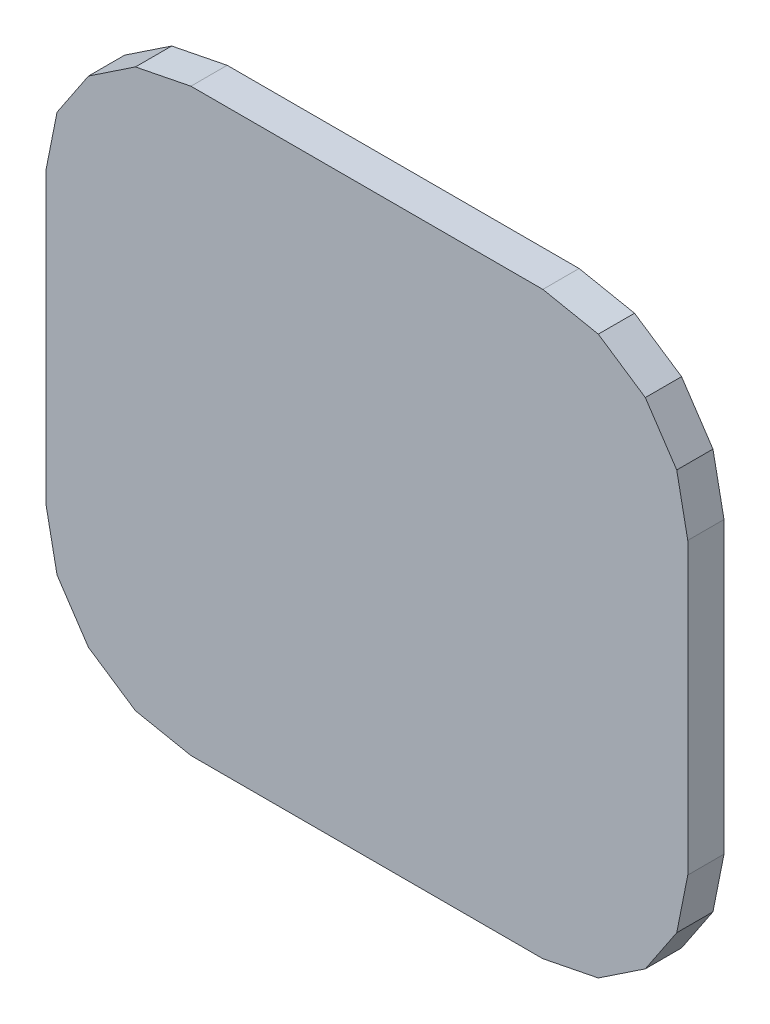
ISO-10303-21;
HEADER;
FILE_DESCRIPTION(('STEP AP214'),'2;1');
FILE_NAME('part.step','',(''),(''),'','','');
FILE_SCHEMA(('AUTOMOTIVE_DESIGN { 1 0 10303 214 1 1 1 1 }'));
ENDSEC;
DATA;
#1=APPLICATION_CONTEXT('core data for automotive mechanical design processes');
#2=APPLICATION_PROTOCOL_DEFINITION('international standard','automotive_design',2000,#1);
#3=PRODUCT_CONTEXT('',#1,'mechanical');
#4=PRODUCT('Part','Part','',(#3));
#5=PRODUCT_RELATED_PRODUCT_CATEGORY('part','',(#4));
#6=PRODUCT_DEFINITION_FORMATION('','',#4);
#7=PRODUCT_DEFINITION_CONTEXT('part definition',#1,'design');
#8=PRODUCT_DEFINITION('design','',#6,#7);
#9=PRODUCT_DEFINITION_SHAPE('','',#8);
#10=(LENGTH_UNIT() NAMED_UNIT(*) SI_UNIT(.MILLI.,.METRE.));
#11=(NAMED_UNIT(*) PLANE_ANGLE_UNIT() SI_UNIT($,.RADIAN.));
#12=(NAMED_UNIT(*) SI_UNIT($,.STERADIAN.) SOLID_ANGLE_UNIT());
#13=UNCERTAINTY_MEASURE_WITH_UNIT(LENGTH_MEASURE(1.E-05),#10,'distance_accuracy_value','');
#14=(GEOMETRIC_REPRESENTATION_CONTEXT(3) GLOBAL_UNCERTAINTY_ASSIGNED_CONTEXT((#13)) GLOBAL_UNIT_ASSIGNED_CONTEXT((#10,
#11,#12)) REPRESENTATION_CONTEXT('',''));
#15=CARTESIAN_POINT('',(0.,0.,0.));
#16=DIRECTION('',(0.,0.,1.));
#17=DIRECTION('',(1.,0.,0.));
#18=AXIS2_PLACEMENT_3D('',#15,#16,#17);
#19=CARTESIAN_POINT('',(78.76,-110.75,1.635));
#20=DIRECTION('',(0.,0.,-1.));
#21=DIRECTION('',(0.,-1.,0.));
#22=AXIS2_PLACEMENT_3D('',#19,#20,#21);
#23=PLANE('',#22);
#24=DIRECTION('',(0.980785031686367,-0.195091572396073,0.));
#25=VECTOR('',#24,1.);
#26=CARTESIAN_POINT('',(78.93,-110.47,1.635));
#27=LINE('',#26,#25);
#28=CARTESIAN_POINT('',(78.93,-110.47,1.635));
#29=VERTEX_POINT('',#28);
#30=CARTESIAN_POINT('',(78.983576,-110.480657,1.635));
#31=VERTEX_POINT('',#30);
#32=EDGE_CURVE('E26',#29,#31,#27,.T.);
#33=ORIENTED_EDGE('',*,*,#32,.F.);
#34=DIRECTION('',(1.,0.,0.));
#35=VECTOR('',#34,1.);
#36=CARTESIAN_POINT('',(78.59,-110.47,1.635));
#37=LINE('',#36,#35);
#38=CARTESIAN_POINT('',(78.59,-110.47,1.635));
#39=VERTEX_POINT('',#38);
#40=EDGE_CURVE('E20',#39,#29,#37,.T.);
#41=ORIENTED_EDGE('',*,*,#40,.F.);
#42=DIRECTION('',(0.980785031686367,0.195091572396073,0.));
#43=VECTOR('',#42,1.);
#44=CARTESIAN_POINT('',(78.536424,-110.480657,1.635));
#45=LINE('',#44,#43);
#46=CARTESIAN_POINT('',(78.536424,-110.480657,1.635));
#47=VERTEX_POINT('',#46);
#48=EDGE_CURVE('E258',#47,#39,#45,.T.);
#49=ORIENTED_EDGE('',*,*,#48,.F.);
#50=DIRECTION('',(0.831469659284406,0.555570162706272,0.));
#51=VECTOR('',#50,1.);
#52=CARTESIAN_POINT('',(78.491005,-110.511005,1.635));
#53=LINE('',#52,#51);
#54=CARTESIAN_POINT('',(78.491005,-110.511005,1.635));
#55=VERTEX_POINT('',#54);
#56=EDGE_CURVE('E351',#55,#47,#53,.T.);
#57=ORIENTED_EDGE('',*,*,#56,.F.);
#58=DIRECTION('',(0.555570162706272,0.831469659284406,0.));
#59=VECTOR('',#58,1.);
#60=CARTESIAN_POINT('',(78.460657,-110.556424,1.635));
#61=LINE('',#60,#59);
#62=CARTESIAN_POINT('',(78.460657,-110.556424,1.635));
#63=VERTEX_POINT('',#62);
#64=EDGE_CURVE('E339',#63,#55,#61,.T.);
#65=ORIENTED_EDGE('',*,*,#64,.F.);
#66=DIRECTION('',(0.195091572396073,0.980785031686367,0.));
#67=VECTOR('',#66,1.);
#68=CARTESIAN_POINT('',(78.45,-110.61,1.635));
#69=LINE('',#68,#67);
#70=CARTESIAN_POINT('',(78.45,-110.61,1.635));
#71=VERTEX_POINT('',#70);
#72=EDGE_CURVE('E269',#71,#63,#69,.T.);
#73=ORIENTED_EDGE('',*,*,#72,.F.);
#74=DIRECTION('',(0.,1.,0.));
#75=VECTOR('',#74,1.);
#76=CARTESIAN_POINT('',(78.45,-110.89,1.635));
#77=LINE('',#76,#75);
#78=CARTESIAN_POINT('',(78.45,-110.89,1.635));
#79=VERTEX_POINT('',#78);
#80=EDGE_CURVE('E402',#79,#71,#77,.T.);
#81=ORIENTED_EDGE('',*,*,#80,.F.);
#82=DIRECTION('',(-0.195091572396073,0.980785031686367,0.));
#83=VECTOR('',#82,1.);
#84=CARTESIAN_POINT('',(78.460657,-110.943576,1.635));
#85=LINE('',#84,#83);
#86=CARTESIAN_POINT('',(78.460657,-110.943576,1.635));
#87=VERTEX_POINT('',#86);
#88=EDGE_CURVE('E322',#87,#79,#85,.T.);
#89=ORIENTED_EDGE('',*,*,#88,.F.);
#90=DIRECTION('',(-0.555570162706272,0.831469659284406,0.));
#91=VECTOR('',#90,1.);
#92=CARTESIAN_POINT('',(78.491005,-110.988995,1.635));
#93=LINE('',#92,#91);
#94=CARTESIAN_POINT('',(78.491005,-110.988995,1.635));
#95=VERTEX_POINT('',#94);
#96=EDGE_CURVE('E310',#95,#87,#93,.T.);
#97=ORIENTED_EDGE('',*,*,#96,.F.);
#98=DIRECTION('',(-0.831469659284406,0.555570162706272,0.));
#99=VECTOR('',#98,1.);
#100=CARTESIAN_POINT('',(78.536424,-111.019343,1.635));
#101=LINE('',#100,#99);
#102=CARTESIAN_POINT('',(78.536424,-111.019343,1.635));
#103=VERTEX_POINT('',#102);
#104=EDGE_CURVE('E296',#103,#95,#101,.T.);
#105=ORIENTED_EDGE('',*,*,#104,.F.);
#106=DIRECTION('',(-0.980785031686367,0.195091572396073,0.));
#107=VECTOR('',#106,1.);
#108=CARTESIAN_POINT('',(78.59,-111.03,1.635));
#109=LINE('',#108,#107);
#110=CARTESIAN_POINT('',(78.59,-111.03,1.635));
#111=VERTEX_POINT('',#110);
#112=EDGE_CURVE('E244',#111,#103,#109,.T.);
#113=ORIENTED_EDGE('',*,*,#112,.F.);
#114=DIRECTION('',(-1.,0.,0.));
#115=VECTOR('',#114,1.);
#116=CARTESIAN_POINT('',(78.93,-111.03,1.635));
#117=LINE('',#116,#115);
#118=CARTESIAN_POINT('',(78.93,-111.03,1.635));
#119=VERTEX_POINT('',#118);
#120=EDGE_CURVE('E278',#119,#111,#117,.T.);
#121=ORIENTED_EDGE('',*,*,#120,.F.);
#122=DIRECTION('',(-0.980785031686367,-0.195091572396073,0.));
#123=VECTOR('',#122,1.);
#124=CARTESIAN_POINT('',(78.983576,-111.019343,1.635));
#125=LINE('',#124,#123);
#126=CARTESIAN_POINT('',(78.983576,-111.019343,1.635));
#127=VERTEX_POINT('',#126);
#128=EDGE_CURVE('E263',#127,#119,#125,.T.);
#129=ORIENTED_EDGE('',*,*,#128,.F.);
#130=DIRECTION('',(-0.831469659284406,-0.555570162706272,0.));
#131=VECTOR('',#130,1.);
#132=CARTESIAN_POINT('',(79.028995,-110.988995,1.635));
#133=LINE('',#132,#131);
#134=CARTESIAN_POINT('',(79.028995,-110.988995,1.635));
#135=VERTEX_POINT('',#134);
#136=EDGE_CURVE('E203',#135,#127,#133,.T.);
#137=ORIENTED_EDGE('',*,*,#136,.F.);
#138=DIRECTION('',(-0.555570162706272,-0.831469659284406,0.));
#139=VECTOR('',#138,1.);
#140=CARTESIAN_POINT('',(79.059343,-110.943576,1.635));
#141=LINE('',#140,#139);
#142=CARTESIAN_POINT('',(79.059343,-110.943576,1.635));
#143=VERTEX_POINT('',#142);
#144=EDGE_CURVE('E197',#143,#135,#141,.T.);
#145=ORIENTED_EDGE('',*,*,#144,.F.);
#146=DIRECTION('',(-0.195091572396073,-0.980785031686367,0.));
#147=VECTOR('',#146,1.);
#148=CARTESIAN_POINT('',(79.07,-110.89,1.635));
#149=LINE('',#148,#147);
#150=CARTESIAN_POINT('',(79.07,-110.89,1.635));
#151=VERTEX_POINT('',#150);
#152=EDGE_CURVE('E200',#151,#143,#149,.T.);
#153=ORIENTED_EDGE('',*,*,#152,.F.);
#154=DIRECTION('',(0.,-1.,0.));
#155=VECTOR('',#154,1.);
#156=CARTESIAN_POINT('',(79.07,-110.61,1.635));
#157=LINE('',#156,#155);
#158=CARTESIAN_POINT('',(79.07,-110.61,1.635));
#159=VERTEX_POINT('',#158);
#160=EDGE_CURVE('E408',#159,#151,#157,.T.);
#161=ORIENTED_EDGE('',*,*,#160,.F.);
#162=DIRECTION('',(0.195091572396073,-0.980785031686367,0.));
#163=VECTOR('',#162,1.);
#164=CARTESIAN_POINT('',(79.059343,-110.556424,1.635));
#165=LINE('',#164,#163);
#166=CARTESIAN_POINT('',(79.059343,-110.556424,1.635));
#167=VERTEX_POINT('',#166);
#168=EDGE_CURVE('E435',#167,#159,#165,.T.);
#169=ORIENTED_EDGE('',*,*,#168,.F.);
#170=DIRECTION('',(0.555570162706272,-0.831469659284406,0.));
#171=VECTOR('',#170,1.);
#172=CARTESIAN_POINT('',(79.028995,-110.511005,1.635));
#173=LINE('',#172,#171);
#174=CARTESIAN_POINT('',(79.028995,-110.511005,1.635));
#175=VERTEX_POINT('',#174);
#176=EDGE_CURVE('E391',#175,#167,#173,.T.);
#177=ORIENTED_EDGE('',*,*,#176,.F.);
#178=DIRECTION('',(0.831469659284406,-0.555570162706272,0.));
#179=VECTOR('',#178,1.);
#180=CARTESIAN_POINT('',(78.983576,-110.480657,1.635));
#181=LINE('',#180,#179);
#182=EDGE_CURVE('E394',#31,#175,#181,.T.);
#183=ORIENTED_EDGE('',*,*,#182,.F.);
#184=EDGE_LOOP('',(#33,#41,#49,#57,#65,#73,#81,#89,#97,#105,#113,#121,#129,#137,#145,#153,#161,
#169,#177,#183));
#185=FACE_BOUND('',#184,.T.);
#186=ADVANCED_FACE('F17',(#185),#23,.F.);
#187=CARTESIAN_POINT('',(78.76,-110.75,1.6));
#188=DIRECTION('',(0.,0.,-1.));
#189=DIRECTION('',(0.,-1.,0.));
#190=AXIS2_PLACEMENT_3D('',#187,#188,#189);
#191=PLANE('',#190);
#192=DIRECTION('',(0.831469659284406,-0.555570162706272,0.));
#193=VECTOR('',#192,1.);
#194=CARTESIAN_POINT('',(78.983576,-110.480657,1.6));
#195=LINE('',#194,#193);
#196=CARTESIAN_POINT('',(78.983576,-110.480657,1.6));
#197=VERTEX_POINT('',#196);
#198=CARTESIAN_POINT('',(79.028995,-110.511005,1.6));
#199=VERTEX_POINT('',#198);
#200=EDGE_CURVE('E381',#197,#199,#195,.T.);
#201=ORIENTED_EDGE('',*,*,#200,.T.);
#202=DIRECTION('',(0.555570162706272,-0.831469659284406,0.));
#203=VECTOR('',#202,1.);
#204=CARTESIAN_POINT('',(79.028995,-110.511005,1.6));
#205=LINE('',#204,#203);
#206=CARTESIAN_POINT('',(79.059343,-110.556424,1.6));
#207=VERTEX_POINT('',#206);
#208=EDGE_CURVE('E428',#199,#207,#205,.T.);
#209=ORIENTED_EDGE('',*,*,#208,.T.);
#210=DIRECTION('',(0.195091572396073,-0.980785031686367,0.));
#211=VECTOR('',#210,1.);
#212=CARTESIAN_POINT('',(79.059343,-110.556424,1.6));
#213=LINE('',#212,#211);
#214=CARTESIAN_POINT('',(79.07,-110.61,1.6));
#215=VERTEX_POINT('',#214);
#216=EDGE_CURVE('E405',#207,#215,#213,.T.);
#217=ORIENTED_EDGE('',*,*,#216,.T.);
#218=DIRECTION('',(0.,-1.,0.));
#219=VECTOR('',#218,1.);
#220=CARTESIAN_POINT('',(79.07,-110.61,1.6));
#221=LINE('',#220,#219);
#222=CARTESIAN_POINT('',(79.07,-110.89,1.6));
#223=VERTEX_POINT('',#222);
#224=EDGE_CURVE('E225',#215,#223,#221,.T.);
#225=ORIENTED_EDGE('',*,*,#224,.T.);
#226=DIRECTION('',(-0.195091572396073,-0.980785031686367,0.));
#227=VECTOR('',#226,1.);
#228=CARTESIAN_POINT('',(79.07,-110.89,1.6));
#229=LINE('',#228,#227);
#230=CARTESIAN_POINT('',(79.059343,-110.943576,1.6));
#231=VERTEX_POINT('',#230);
#232=EDGE_CURVE('E209',#223,#231,#229,.T.);
#233=ORIENTED_EDGE('',*,*,#232,.T.);
#234=DIRECTION('',(-0.555570162706272,-0.831469659284406,0.));
#235=VECTOR('',#234,1.);
#236=CARTESIAN_POINT('',(79.059343,-110.943576,1.6));
#237=LINE('',#236,#235);
#238=CARTESIAN_POINT('',(79.028995,-110.988995,1.6));
#239=VERTEX_POINT('',#238);
#240=EDGE_CURVE('E215',#231,#239,#237,.T.);
#241=ORIENTED_EDGE('',*,*,#240,.T.);
#242=DIRECTION('',(-0.831469659284406,-0.555570162706272,0.));
#243=VECTOR('',#242,1.);
#244=CARTESIAN_POINT('',(79.028995,-110.988995,1.6));
#245=LINE('',#244,#243);
#246=CARTESIAN_POINT('',(78.983576,-111.019343,1.6));
#247=VERTEX_POINT('',#246);
#248=EDGE_CURVE('E253',#239,#247,#245,.T.);
#249=ORIENTED_EDGE('',*,*,#248,.T.);
#250=DIRECTION('',(-0.980785031686367,-0.195091572396073,0.));
#251=VECTOR('',#250,1.);
#252=CARTESIAN_POINT('',(78.983576,-111.019343,1.6));
#253=LINE('',#252,#251);
#254=CARTESIAN_POINT('',(78.93,-111.03,1.6));
#255=VERTEX_POINT('',#254);
#256=EDGE_CURVE('E274',#247,#255,#253,.T.);
#257=ORIENTED_EDGE('',*,*,#256,.T.);
#258=DIRECTION('',(-1.,0.,0.));
#259=VECTOR('',#258,1.);
#260=CARTESIAN_POINT('',(78.93,-111.03,1.6));
#261=LINE('',#260,#259);
#262=CARTESIAN_POINT('',(78.59,-111.03,1.6));
#263=VERTEX_POINT('',#262);
#264=EDGE_CURVE('E286',#255,#263,#261,.T.);
#265=ORIENTED_EDGE('',*,*,#264,.T.);
#266=DIRECTION('',(-0.980785031686367,0.195091572396073,0.));
#267=VECTOR('',#266,1.);
#268=CARTESIAN_POINT('',(78.59,-111.03,1.6));
#269=LINE('',#268,#267);
#270=CARTESIAN_POINT('',(78.536424,-111.019343,1.6));
#271=VERTEX_POINT('',#270);
#272=EDGE_CURVE('E243',#263,#271,#269,.T.);
#273=ORIENTED_EDGE('',*,*,#272,.T.);
#274=DIRECTION('',(-0.831469659284406,0.555570162706272,0.));
#275=VECTOR('',#274,1.);
#276=CARTESIAN_POINT('',(78.536424,-111.019343,1.6));
#277=LINE('',#276,#275);
#278=CARTESIAN_POINT('',(78.491005,-110.988995,1.6));
#279=VERTEX_POINT('',#278);
#280=EDGE_CURVE('E304',#271,#279,#277,.T.);
#281=ORIENTED_EDGE('',*,*,#280,.T.);
#282=DIRECTION('',(-0.555570162706272,0.831469659284406,0.));
#283=VECTOR('',#282,1.);
#284=CARTESIAN_POINT('',(78.491005,-110.988995,1.6));
#285=LINE('',#284,#283);
#286=CARTESIAN_POINT('',(78.460657,-110.943576,1.6));
#287=VERTEX_POINT('',#286);
#288=EDGE_CURVE('E318',#279,#287,#285,.T.);
#289=ORIENTED_EDGE('',*,*,#288,.T.);
#290=DIRECTION('',(-0.195091572396073,0.980785031686367,0.));
#291=VECTOR('',#290,1.);
#292=CARTESIAN_POINT('',(78.460657,-110.943576,1.6));
#293=LINE('',#292,#291);
#294=CARTESIAN_POINT('',(78.45,-110.89,1.6));
#295=VERTEX_POINT('',#294);
#296=EDGE_CURVE('E326',#287,#295,#293,.T.);
#297=ORIENTED_EDGE('',*,*,#296,.T.);
#298=DIRECTION('',(0.,1.,0.));
#299=VECTOR('',#298,1.);
#300=CARTESIAN_POINT('',(78.45,-110.89,1.6));
#301=LINE('',#300,#299);
#302=CARTESIAN_POINT('',(78.45,-110.61,1.6));
#303=VERTEX_POINT('',#302);
#304=EDGE_CURVE('E328',#295,#303,#301,.T.);
#305=ORIENTED_EDGE('',*,*,#304,.T.);
#306=DIRECTION('',(0.195091572396073,0.980785031686367,0.));
#307=VECTOR('',#306,1.);
#308=CARTESIAN_POINT('',(78.45,-110.61,1.6));
#309=LINE('',#308,#307);
#310=CARTESIAN_POINT('',(78.460657,-110.556424,1.6));
#311=VERTEX_POINT('',#310);
#312=EDGE_CURVE('E268',#303,#311,#309,.T.);
#313=ORIENTED_EDGE('',*,*,#312,.T.);
#314=DIRECTION('',(0.555570162706272,0.831469659284406,0.));
#315=VECTOR('',#314,1.);
#316=CARTESIAN_POINT('',(78.460657,-110.556424,1.6));
#317=LINE('',#316,#315);
#318=CARTESIAN_POINT('',(78.491005,-110.511005,1.6));
#319=VERTEX_POINT('',#318);
#320=EDGE_CURVE('E347',#311,#319,#317,.T.);
#321=ORIENTED_EDGE('',*,*,#320,.T.);
#322=DIRECTION('',(0.831469659284406,0.555570162706272,0.));
#323=VECTOR('',#322,1.);
#324=CARTESIAN_POINT('',(78.491005,-110.511005,1.6));
#325=LINE('',#324,#323);
#326=CARTESIAN_POINT('',(78.536424,-110.480657,1.6));
#327=VERTEX_POINT('',#326);
#328=EDGE_CURVE('E254',#319,#327,#325,.T.);
#329=ORIENTED_EDGE('',*,*,#328,.T.);
#330=DIRECTION('',(0.980785031686367,0.195091572396073,0.));
#331=VECTOR('',#330,1.);
#332=CARTESIAN_POINT('',(78.536424,-110.480657,1.6));
#333=LINE('',#332,#331);
#334=CARTESIAN_POINT('',(78.59,-110.47,1.6));
#335=VERTEX_POINT('',#334);
#336=EDGE_CURVE('E358',#327,#335,#333,.T.);
#337=ORIENTED_EDGE('',*,*,#336,.T.);
#338=DIRECTION('',(1.,0.,0.));
#339=VECTOR('',#338,1.);
#340=CARTESIAN_POINT('',(78.59,-110.47,1.6));
#341=LINE('',#340,#339);
#342=CARTESIAN_POINT('',(78.93,-110.47,1.6));
#343=VERTEX_POINT('',#342);
#344=EDGE_CURVE('E279',#335,#343,#341,.T.);
#345=ORIENTED_EDGE('',*,*,#344,.T.);
#346=DIRECTION('',(0.980785031686367,-0.195091572396073,0.));
#347=VECTOR('',#346,1.);
#348=CARTESIAN_POINT('',(78.93,-110.47,1.6));
#349=LINE('',#348,#347);
#350=EDGE_CURVE('E11',#343,#197,#349,.T.);
#351=ORIENTED_EDGE('',*,*,#350,.T.);
#352=EDGE_LOOP('',(#201,#209,#217,#225,#233,#241,#249,#257,#265,#273,#281,#289,#297,#305,#313,
#321,#329,#337,#345,#351));
#353=FACE_BOUND('',#352,.T.);
#354=ADVANCED_FACE('F378',(#353),#191,.T.);
#355=CARTESIAN_POINT('',(78.93,-110.47,1.6));
#356=DIRECTION('',(0.195091572396073,0.980785031686367,0.));
#357=DIRECTION('',(0.,0.,-1.));
#358=AXIS2_PLACEMENT_3D('',#355,#356,#357);
#359=PLANE('',#358);
#360=DIRECTION('',(0.,0.,1.));
#361=VECTOR('',#360,1.);
#362=CARTESIAN_POINT('',(78.93,-110.47,1.6));
#363=LINE('',#362,#361);
#364=EDGE_CURVE('E235',#343,#29,#363,.T.);
#365=ORIENTED_EDGE('',*,*,#364,.T.);
#366=ORIENTED_EDGE('',*,*,#32,.T.);
#367=DIRECTION('',(0.,0.,1.));
#368=VECTOR('',#367,1.);
#369=CARTESIAN_POINT('',(78.983576,-110.480657,1.6));
#370=LINE('',#369,#368);
#371=EDGE_CURVE('E387',#197,#31,#370,.T.);
#372=ORIENTED_EDGE('',*,*,#371,.F.);
#373=ORIENTED_EDGE('',*,*,#350,.F.);
#374=EDGE_LOOP('',(#365,#366,#372,#373));
#375=FACE_BOUND('',#374,.T.);
#376=ADVANCED_FACE('F374',(#375),#359,.T.);
#377=CARTESIAN_POINT('',(78.59,-110.47,1.6));
#378=DIRECTION('',(0.,1.,0.));
#379=DIRECTION('',(1.,0.,0.));
#380=AXIS2_PLACEMENT_3D('',#377,#378,#379);
#381=PLANE('',#380);
#382=DIRECTION('',(0.,0.,1.));
#383=VECTOR('',#382,1.);
#384=CARTESIAN_POINT('',(78.59,-110.47,1.6));
#385=LINE('',#384,#383);
#386=EDGE_CURVE('E355',#335,#39,#385,.T.);
#387=ORIENTED_EDGE('',*,*,#386,.T.);
#388=ORIENTED_EDGE('',*,*,#40,.T.);
#389=ORIENTED_EDGE('',*,*,#364,.F.);
#390=ORIENTED_EDGE('',*,*,#344,.F.);
#391=EDGE_LOOP('',(#387,#388,#389,#390));
#392=FACE_BOUND('',#391,.T.);
#393=ADVANCED_FACE('F375',(#392),#381,.T.);
#394=CARTESIAN_POINT('',(78.536424,-110.480657,1.6));
#395=DIRECTION('',(-0.195091572396073,0.980785031686367,0.));
#396=DIRECTION('',(0.,0.,1.));
#397=AXIS2_PLACEMENT_3D('',#394,#395,#396);
#398=PLANE('',#397);
#399=DIRECTION('',(0.,0.,1.));
#400=VECTOR('',#399,1.);
#401=CARTESIAN_POINT('',(78.536424,-110.480657,1.6));
#402=LINE('',#401,#400);
#403=EDGE_CURVE('E259',#327,#47,#402,.T.);
#404=ORIENTED_EDGE('',*,*,#403,.T.);
#405=ORIENTED_EDGE('',*,*,#48,.T.);
#406=ORIENTED_EDGE('',*,*,#386,.F.);
#407=ORIENTED_EDGE('',*,*,#336,.F.);
#408=EDGE_LOOP('',(#404,#405,#406,#407));
#409=FACE_BOUND('',#408,.T.);
#410=ADVANCED_FACE('F783',(#409),#398,.T.);
#411=CARTESIAN_POINT('',(78.491005,-110.511005,1.6));
#412=DIRECTION('',(-0.555570162706272,0.831469659284406,0.));
#413=DIRECTION('',(0.,0.,1.));
#414=AXIS2_PLACEMENT_3D('',#411,#412,#413);
#415=PLANE('',#414);
#416=DIRECTION('',(0.,0.,1.));
#417=VECTOR('',#416,1.);
#418=CARTESIAN_POINT('',(78.491005,-110.511005,1.6));
#419=LINE('',#418,#417);
#420=EDGE_CURVE('E343',#319,#55,#419,.T.);
#421=ORIENTED_EDGE('',*,*,#420,.T.);
#422=ORIENTED_EDGE('',*,*,#56,.T.);
#423=ORIENTED_EDGE('',*,*,#403,.F.);
#424=ORIENTED_EDGE('',*,*,#328,.F.);
#425=EDGE_LOOP('',(#421,#422,#423,#424));
#426=FACE_BOUND('',#425,.T.);
#427=ADVANCED_FACE('F774',(#426),#415,.T.);
#428=CARTESIAN_POINT('',(78.460657,-110.556424,1.6));
#429=DIRECTION('',(-0.831469659284406,0.555570162706272,0.));
#430=DIRECTION('',(0.,0.,1.));
#431=AXIS2_PLACEMENT_3D('',#428,#429,#430);
#432=PLANE('',#431);
#433=DIRECTION('',(0.,0.,1.));
#434=VECTOR('',#433,1.);
#435=CARTESIAN_POINT('',(78.460657,-110.556424,1.6));
#436=LINE('',#435,#434);
#437=EDGE_CURVE('E264',#311,#63,#436,.T.);
#438=ORIENTED_EDGE('',*,*,#437,.T.);
#439=ORIENTED_EDGE('',*,*,#64,.T.);
#440=ORIENTED_EDGE('',*,*,#420,.F.);
#441=ORIENTED_EDGE('',*,*,#320,.F.);
#442=EDGE_LOOP('',(#438,#439,#440,#441));
#443=FACE_BOUND('',#442,.T.);
#444=ADVANCED_FACE('F765',(#443),#432,.T.);
#445=CARTESIAN_POINT('',(78.45,-110.61,1.6));
#446=DIRECTION('',(-0.980785031686367,0.195091572396073,0.));
#447=DIRECTION('',(0.,0.,1.));
#448=AXIS2_PLACEMENT_3D('',#445,#446,#447);
#449=PLANE('',#448);
#450=DIRECTION('',(0.,0.,1.));
#451=VECTOR('',#450,1.);
#452=CARTESIAN_POINT('',(78.45,-110.61,1.6));
#453=LINE('',#452,#451);
#454=EDGE_CURVE('E332',#303,#71,#453,.T.);
#455=ORIENTED_EDGE('',*,*,#454,.T.);
#456=ORIENTED_EDGE('',*,*,#72,.T.);
#457=ORIENTED_EDGE('',*,*,#437,.F.);
#458=ORIENTED_EDGE('',*,*,#312,.F.);
#459=EDGE_LOOP('',(#455,#456,#457,#458));
#460=FACE_BOUND('',#459,.T.);
#461=ADVANCED_FACE('F755',(#460),#449,.T.);
#462=CARTESIAN_POINT('',(78.45,-110.89,1.6));
#463=DIRECTION('',(-1.,0.,0.));
#464=DIRECTION('',(0.,0.,1.));
#465=AXIS2_PLACEMENT_3D('',#462,#463,#464);
#466=PLANE('',#465);
#467=DIRECTION('',(0.,0.,1.));
#468=VECTOR('',#467,1.);
#469=CARTESIAN_POINT('',(78.45,-110.89,1.6));
#470=LINE('',#469,#468);
#471=EDGE_CURVE('E323',#295,#79,#470,.T.);
#472=ORIENTED_EDGE('',*,*,#471,.T.);
#473=ORIENTED_EDGE('',*,*,#80,.T.);
#474=ORIENTED_EDGE('',*,*,#454,.F.);
#475=ORIENTED_EDGE('',*,*,#304,.F.);
#476=EDGE_LOOP('',(#472,#473,#474,#475));
#477=FACE_BOUND('',#476,.T.);
#478=ADVANCED_FACE('F745',(#477),#466,.T.);
#479=CARTESIAN_POINT('',(78.460657,-110.943576,1.6));
#480=DIRECTION('',(-0.980785031686367,-0.195091572396073,0.));
#481=DIRECTION('',(-0.195091572396073,0.980785031686367,0.));
#482=AXIS2_PLACEMENT_3D('',#479,#480,#481);
#483=PLANE('',#482);
#484=DIRECTION('',(0.,0.,1.));
#485=VECTOR('',#484,1.);
#486=CARTESIAN_POINT('',(78.460657,-110.943576,1.6));
#487=LINE('',#486,#485);
#488=EDGE_CURVE('E314',#287,#87,#487,.T.);
#489=ORIENTED_EDGE('',*,*,#488,.T.);
#490=ORIENTED_EDGE('',*,*,#88,.T.);
#491=ORIENTED_EDGE('',*,*,#471,.F.);
#492=ORIENTED_EDGE('',*,*,#296,.F.);
#493=EDGE_LOOP('',(#489,#490,#491,#492));
#494=FACE_BOUND('',#493,.T.);
#495=ADVANCED_FACE('F735',(#494),#483,.T.);
#496=CARTESIAN_POINT('',(78.491005,-110.988995,1.6));
#497=DIRECTION('',(-0.831469659284406,-0.555570162706272,0.));
#498=DIRECTION('',(-0.555570162706272,0.831469659284406,0.));
#499=AXIS2_PLACEMENT_3D('',#496,#497,#498);
#500=PLANE('',#499);
#501=DIRECTION('',(0.,0.,1.));
#502=VECTOR('',#501,1.);
#503=CARTESIAN_POINT('',(78.491005,-110.988995,1.6));
#504=LINE('',#503,#502);
#505=EDGE_CURVE('E300',#279,#95,#504,.T.);
#506=ORIENTED_EDGE('',*,*,#505,.T.);
#507=ORIENTED_EDGE('',*,*,#96,.T.);
#508=ORIENTED_EDGE('',*,*,#488,.F.);
#509=ORIENTED_EDGE('',*,*,#288,.F.);
#510=EDGE_LOOP('',(#506,#507,#508,#509));
#511=FACE_BOUND('',#510,.T.);
#512=ADVANCED_FACE('F725',(#511),#500,.T.);
#513=CARTESIAN_POINT('',(78.536424,-111.019343,1.6));
#514=DIRECTION('',(-0.555570162706272,-0.831469659284406,0.));
#515=DIRECTION('',(-0.831469659284406,0.555570162706272,0.));
#516=AXIS2_PLACEMENT_3D('',#513,#514,#515);
#517=PLANE('',#516);
#518=DIRECTION('',(0.,0.,1.));
#519=VECTOR('',#518,1.);
#520=CARTESIAN_POINT('',(78.536424,-111.019343,1.6));
#521=LINE('',#520,#519);
#522=EDGE_CURVE('E239',#271,#103,#521,.T.);
#523=ORIENTED_EDGE('',*,*,#522,.T.);
#524=ORIENTED_EDGE('',*,*,#104,.T.);
#525=ORIENTED_EDGE('',*,*,#505,.F.);
#526=ORIENTED_EDGE('',*,*,#280,.F.);
#527=EDGE_LOOP('',(#523,#524,#525,#526));
#528=FACE_BOUND('',#527,.T.);
#529=ADVANCED_FACE('F715',(#528),#517,.T.);
#530=CARTESIAN_POINT('',(78.59,-111.03,1.6));
#531=DIRECTION('',(-0.195091572396073,-0.980785031686367,0.));
#532=DIRECTION('',(-0.980785031686367,0.195091572396073,0.));
#533=AXIS2_PLACEMENT_3D('',#530,#531,#532);
#534=PLANE('',#533);
#535=DIRECTION('',(0.,0.,1.));
#536=VECTOR('',#535,1.);
#537=CARTESIAN_POINT('',(78.59,-111.03,1.6));
#538=LINE('',#537,#536);
#539=EDGE_CURVE('E282',#263,#111,#538,.T.);
#540=ORIENTED_EDGE('',*,*,#539,.T.);
#541=ORIENTED_EDGE('',*,*,#112,.T.);
#542=ORIENTED_EDGE('',*,*,#522,.F.);
#543=ORIENTED_EDGE('',*,*,#272,.F.);
#544=EDGE_LOOP('',(#540,#541,#542,#543));
#545=FACE_BOUND('',#544,.T.);
#546=ADVANCED_FACE('F705',(#545),#534,.T.);
#547=CARTESIAN_POINT('',(78.93,-111.03,1.6));
#548=DIRECTION('',(0.,-1.,0.));
#549=DIRECTION('',(0.,0.,-1.));
#550=AXIS2_PLACEMENT_3D('',#547,#548,#549);
#551=PLANE('',#550);
#552=DIRECTION('',(0.,0.,1.));
#553=VECTOR('',#552,1.);
#554=CARTESIAN_POINT('',(78.93,-111.03,1.6));
#555=LINE('',#554,#553);
#556=EDGE_CURVE('E270',#255,#119,#555,.T.);
#557=ORIENTED_EDGE('',*,*,#556,.T.);
#558=ORIENTED_EDGE('',*,*,#120,.T.);
#559=ORIENTED_EDGE('',*,*,#539,.F.);
#560=ORIENTED_EDGE('',*,*,#264,.F.);
#561=EDGE_LOOP('',(#557,#558,#559,#560));
#562=FACE_BOUND('',#561,.T.);
#563=ADVANCED_FACE('F695',(#562),#551,.T.);
#564=CARTESIAN_POINT('',(78.983576,-111.019343,1.6));
#565=DIRECTION('',(0.195091572396073,-0.980785031686367,0.));
#566=DIRECTION('',(0.,0.,-1.));
#567=AXIS2_PLACEMENT_3D('',#564,#565,#566);
#568=PLANE('',#567);
#569=DIRECTION('',(0.,0.,1.));
#570=VECTOR('',#569,1.);
#571=CARTESIAN_POINT('',(78.983576,-111.019343,1.6));
#572=LINE('',#571,#570);
#573=EDGE_CURVE('E249',#247,#127,#572,.T.);
#574=ORIENTED_EDGE('',*,*,#573,.T.);
#575=ORIENTED_EDGE('',*,*,#128,.T.);
#576=ORIENTED_EDGE('',*,*,#556,.F.);
#577=ORIENTED_EDGE('',*,*,#256,.F.);
#578=EDGE_LOOP('',(#574,#575,#576,#577));
#579=FACE_BOUND('',#578,.T.);
#580=ADVANCED_FACE('F685',(#579),#568,.T.);
#581=CARTESIAN_POINT('',(79.028995,-110.988995,1.6));
#582=DIRECTION('',(0.555570162706272,-0.831469659284406,0.));
#583=DIRECTION('',(0.,0.,-1.));
#584=AXIS2_PLACEMENT_3D('',#581,#582,#583);
#585=PLANE('',#584);
#586=DIRECTION('',(0.,0.,1.));
#587=VECTOR('',#586,1.);
#588=CARTESIAN_POINT('',(79.028995,-110.988995,1.6));
#589=LINE('',#588,#587);
#590=EDGE_CURVE('E208',#239,#135,#589,.T.);
#591=ORIENTED_EDGE('',*,*,#590,.T.);
#592=ORIENTED_EDGE('',*,*,#136,.T.);
#593=ORIENTED_EDGE('',*,*,#573,.F.);
#594=ORIENTED_EDGE('',*,*,#248,.F.);
#595=EDGE_LOOP('',(#591,#592,#593,#594));
#596=FACE_BOUND('',#595,.T.);
#597=ADVANCED_FACE('F675',(#596),#585,.T.);
#598=CARTESIAN_POINT('',(79.059343,-110.943576,1.6));
#599=DIRECTION('',(0.831469659284406,-0.555570162706272,0.));
#600=DIRECTION('',(0.,0.,-1.));
#601=AXIS2_PLACEMENT_3D('',#598,#599,#600);
#602=PLANE('',#601);
#603=DIRECTION('',(0.,0.,1.));
#604=VECTOR('',#603,1.);
#605=CARTESIAN_POINT('',(79.059343,-110.943576,1.6));
#606=LINE('',#605,#604);
#607=EDGE_CURVE('E212',#231,#143,#606,.T.);
#608=ORIENTED_EDGE('',*,*,#607,.T.);
#609=ORIENTED_EDGE('',*,*,#144,.T.);
#610=ORIENTED_EDGE('',*,*,#590,.F.);
#611=ORIENTED_EDGE('',*,*,#240,.F.);
#612=EDGE_LOOP('',(#608,#609,#610,#611));
#613=FACE_BOUND('',#612,.T.);
#614=ADVANCED_FACE('F213',(#613),#602,.T.);
#615=CARTESIAN_POINT('',(79.07,-110.89,1.6));
#616=DIRECTION('',(0.980785031686367,-0.195091572396073,0.));
#617=DIRECTION('',(0.,0.,-1.));
#618=AXIS2_PLACEMENT_3D('',#615,#616,#617);
#619=PLANE('',#618);
#620=DIRECTION('',(0.,0.,1.));
#621=VECTOR('',#620,1.);
#622=CARTESIAN_POINT('',(79.07,-110.89,1.6));
#623=LINE('',#622,#621);
#624=EDGE_CURVE('E222',#223,#151,#623,.T.);
#625=ORIENTED_EDGE('',*,*,#624,.T.);
#626=ORIENTED_EDGE('',*,*,#152,.T.);
#627=ORIENTED_EDGE('',*,*,#607,.F.);
#628=ORIENTED_EDGE('',*,*,#232,.F.);
#629=EDGE_LOOP('',(#625,#626,#627,#628));
#630=FACE_BOUND('',#629,.T.);
#631=ADVANCED_FACE('F220',(#630),#619,.T.);
#632=CARTESIAN_POINT('',(79.07,-110.61,1.6));
#633=DIRECTION('',(1.,0.,0.));
#634=DIRECTION('',(0.,1.,0.));
#635=AXIS2_PLACEMENT_3D('',#632,#633,#634);
#636=PLANE('',#635);
#637=DIRECTION('',(0.,0.,1.));
#638=VECTOR('',#637,1.);
#639=CARTESIAN_POINT('',(79.07,-110.61,1.6));
#640=LINE('',#639,#638);
#641=EDGE_CURVE('E409',#215,#159,#640,.T.);
#642=ORIENTED_EDGE('',*,*,#641,.T.);
#643=ORIENTED_EDGE('',*,*,#160,.T.);
#644=ORIENTED_EDGE('',*,*,#624,.F.);
#645=ORIENTED_EDGE('',*,*,#224,.F.);
#646=EDGE_LOOP('',(#642,#643,#644,#645));
#647=FACE_BOUND('',#646,.T.);
#648=ADVANCED_FACE('F648',(#647),#636,.T.);
#649=CARTESIAN_POINT('',(79.059343,-110.556424,1.6));
#650=DIRECTION('',(0.980785031686367,0.195091572396073,0.));
#651=DIRECTION('',(0.,0.,-1.));
#652=AXIS2_PLACEMENT_3D('',#649,#650,#651);
#653=PLANE('',#652);
#654=DIRECTION('',(0.,0.,1.));
#655=VECTOR('',#654,1.);
#656=CARTESIAN_POINT('',(79.059343,-110.556424,1.6));
#657=LINE('',#656,#655);
#658=EDGE_CURVE('E424',#207,#167,#657,.T.);
#659=ORIENTED_EDGE('',*,*,#658,.T.);
#660=ORIENTED_EDGE('',*,*,#168,.T.);
#661=ORIENTED_EDGE('',*,*,#641,.F.);
#662=ORIENTED_EDGE('',*,*,#216,.F.);
#663=EDGE_LOOP('',(#659,#660,#661,#662));
#664=FACE_BOUND('',#663,.T.);
#665=ADVANCED_FACE('F637',(#664),#653,.T.);
#666=CARTESIAN_POINT('',(79.028995,-110.511005,1.6));
#667=DIRECTION('',(0.831469659284406,0.555570162706272,0.));
#668=DIRECTION('',(0.,0.,-1.));
#669=AXIS2_PLACEMENT_3D('',#666,#667,#668);
#670=PLANE('',#669);
#671=DIRECTION('',(0.,0.,1.));
#672=VECTOR('',#671,1.);
#673=CARTESIAN_POINT('',(79.028995,-110.511005,1.6));
#674=LINE('',#673,#672);
#675=EDGE_CURVE('E389',#199,#175,#674,.T.);
#676=ORIENTED_EDGE('',*,*,#675,.T.);
#677=ORIENTED_EDGE('',*,*,#176,.T.);
#678=ORIENTED_EDGE('',*,*,#658,.F.);
#679=ORIENTED_EDGE('',*,*,#208,.F.);
#680=EDGE_LOOP('',(#676,#677,#678,#679));
#681=FACE_BOUND('',#680,.T.);
#682=ADVANCED_FACE('F626',(#681),#670,.T.);
#683=CARTESIAN_POINT('',(78.983576,-110.480657,1.6));
#684=DIRECTION('',(0.555570162706272,0.831469659284406,0.));
#685=DIRECTION('',(0.,0.,-1.));
#686=AXIS2_PLACEMENT_3D('',#683,#684,#685);
#687=PLANE('',#686);
#688=ORIENTED_EDGE('',*,*,#371,.T.);
#689=ORIENTED_EDGE('',*,*,#182,.T.);
#690=ORIENTED_EDGE('',*,*,#675,.F.);
#691=ORIENTED_EDGE('',*,*,#200,.F.);
#692=EDGE_LOOP('',(#688,#689,#690,#691));
#693=FACE_BOUND('',#692,.T.);
#694=ADVANCED_FACE('F385',(#693),#687,.T.);
#695=CLOSED_SHELL('',(#186,#354,#376,#393,#410,#427,#444,#461,#478,#495,#512,#529,#546,#563,
#580,#597,#614,#631,#648,#665,#682,#694));
#696=MANIFOLD_SOLID_BREP('B1',#695);
#697=ADVANCED_BREP_SHAPE_REPRESENTATION('',(#18,#696),#14);
#698=SHAPE_DEFINITION_REPRESENTATION(#9,#697);
ENDSEC;
END-ISO-10303-21;
